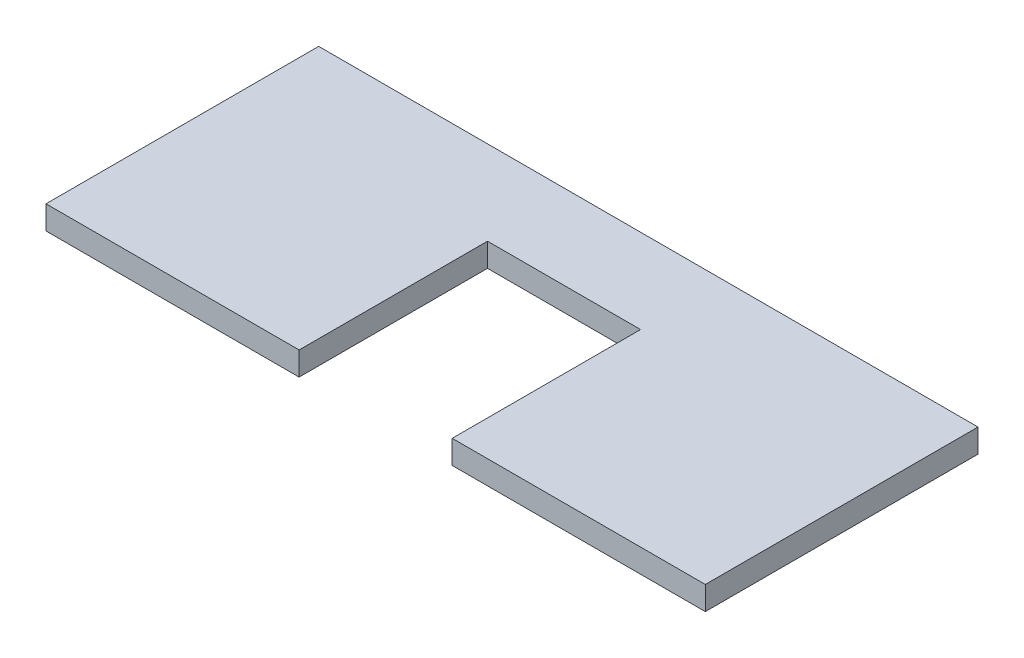
ISO-10303-21;
HEADER;
FILE_DESCRIPTION(('STEP AP214'),'2;1');
FILE_NAME('part.step','',(''),(''),'','','');
FILE_SCHEMA(('AUTOMOTIVE_DESIGN { 1 0 10303 214 1 1 1 1 }'));
ENDSEC;
DATA;
#1=APPLICATION_CONTEXT('core data for automotive mechanical design processes');
#2=APPLICATION_PROTOCOL_DEFINITION('international standard','automotive_design',2000,#1);
#3=PRODUCT_CONTEXT('',#1,'mechanical');
#4=PRODUCT('Part','Part','',(#3));
#5=PRODUCT_RELATED_PRODUCT_CATEGORY('part','',(#4));
#6=PRODUCT_DEFINITION_FORMATION('','',#4);
#7=PRODUCT_DEFINITION_CONTEXT('part definition',#1,'design');
#8=PRODUCT_DEFINITION('design','',#6,#7);
#9=PRODUCT_DEFINITION_SHAPE('','',#8);
#10=(LENGTH_UNIT() NAMED_UNIT(*) SI_UNIT(.MILLI.,.METRE.));
#11=(NAMED_UNIT(*) PLANE_ANGLE_UNIT() SI_UNIT($,.RADIAN.));
#12=(NAMED_UNIT(*) SI_UNIT($,.STERADIAN.) SOLID_ANGLE_UNIT());
#13=UNCERTAINTY_MEASURE_WITH_UNIT(LENGTH_MEASURE(1.E-05),#10,'distance_accuracy_value','');
#14=(GEOMETRIC_REPRESENTATION_CONTEXT(3) GLOBAL_UNCERTAINTY_ASSIGNED_CONTEXT((#13)) GLOBAL_UNIT_ASSIGNED_CONTEXT((#10,
#11,#12)) REPRESENTATION_CONTEXT('',''));
#15=CARTESIAN_POINT('',(0.,0.,0.));
#16=DIRECTION('',(0.,0.,1.));
#17=DIRECTION('',(1.,0.,0.));
#18=AXIS2_PLACEMENT_3D('',#15,#16,#17);
#19=CARTESIAN_POINT('',(-177.8,12.7,-45.466));
#20=DIRECTION('',(1.,0.,0.));
#21=DIRECTION('',(0.,0.,-1.));
#22=AXIS2_PLACEMENT_3D('',#19,#20,#21);
#23=PLANE('',#22);
#24=DIRECTION('',(0.,0.,1.));
#25=VECTOR('',#24,1.);
#26=CARTESIAN_POINT('',(-177.8,0.,-45.466));
#27=LINE('',#26,#25);
#28=CARTESIAN_POINT('',(-177.8,0.,-45.466));
#29=VERTEX_POINT('',#28);
#30=CARTESIAN_POINT('',(-177.8,0.,101.6));
#31=VERTEX_POINT('',#30);
#32=EDGE_CURVE('E132',#29,#31,#27,.T.);
#33=ORIENTED_EDGE('',*,*,#32,.T.);
#34=DIRECTION('',(0.,-1.,0.));
#35=VECTOR('',#34,1.);
#36=CARTESIAN_POINT('',(-177.8,12.7,101.6));
#37=LINE('',#36,#35);
#38=CARTESIAN_POINT('',(-177.8,12.7,101.6));
#39=VERTEX_POINT('',#38);
#40=EDGE_CURVE('E11',#39,#31,#37,.T.);
#41=ORIENTED_EDGE('',*,*,#40,.F.);
#42=DIRECTION('',(0.,0.,1.));
#43=VECTOR('',#42,1.);
#44=CARTESIAN_POINT('',(-177.8,12.7,-45.466));
#45=LINE('',#44,#43);
#46=CARTESIAN_POINT('',(-177.8,12.7,-45.466));
#47=VERTEX_POINT('',#46);
#48=EDGE_CURVE('E146',#47,#39,#45,.T.);
#49=ORIENTED_EDGE('',*,*,#48,.F.);
#50=DIRECTION('',(0.,-1.,0.));
#51=VECTOR('',#50,1.);
#52=CARTESIAN_POINT('',(-177.8,12.7,-45.466));
#53=LINE('',#52,#51);
#54=EDGE_CURVE('E128',#47,#29,#53,.T.);
#55=ORIENTED_EDGE('',*,*,#54,.T.);
#56=EDGE_LOOP('',(#33,#41,#49,#55));
#57=FACE_BOUND('',#56,.T.);
#58=ADVANCED_FACE('F36',(#57),#23,.F.);
#59=CARTESIAN_POINT('',(-177.8,12.7,101.6));
#60=DIRECTION('',(0.,0.,-1.));
#61=DIRECTION('',(-1.,0.,0.));
#62=AXIS2_PLACEMENT_3D('',#59,#60,#61);
#63=PLANE('',#62);
#64=DIRECTION('',(1.,0.,0.));
#65=VECTOR('',#64,1.);
#66=CARTESIAN_POINT('',(-177.8,0.,101.6));
#67=LINE('',#66,#65);
#68=CARTESIAN_POINT('',(-41.275,0.,101.6));
#69=VERTEX_POINT('',#68);
#70=EDGE_CURVE('E135',#31,#69,#67,.T.);
#71=ORIENTED_EDGE('',*,*,#70,.T.);
#72=DIRECTION('',(0.,-1.,0.));
#73=VECTOR('',#72,1.);
#74=CARTESIAN_POINT('',(-41.275,12.7,101.6));
#75=LINE('',#74,#73);
#76=CARTESIAN_POINT('',(-41.275,12.7,101.6));
#77=VERTEX_POINT('',#76);
#78=EDGE_CURVE('E44',#77,#69,#75,.T.);
#79=ORIENTED_EDGE('',*,*,#78,.F.);
#80=DIRECTION('',(1.,0.,0.));
#81=VECTOR('',#80,1.);
#82=CARTESIAN_POINT('',(-177.8,12.7,101.6));
#83=LINE('',#82,#81);
#84=EDGE_CURVE('E95',#39,#77,#83,.T.);
#85=ORIENTED_EDGE('',*,*,#84,.F.);
#86=ORIENTED_EDGE('',*,*,#40,.T.);
#87=EDGE_LOOP('',(#71,#79,#85,#86));
#88=FACE_BOUND('',#87,.T.);
#89=ADVANCED_FACE('F181',(#88),#63,.F.);
#90=CARTESIAN_POINT('',(-41.275,12.7,101.6));
#91=DIRECTION('',(-1.,0.,0.));
#92=DIRECTION('',(0.,0.,1.));
#93=AXIS2_PLACEMENT_3D('',#90,#91,#92);
#94=PLANE('',#93);
#95=DIRECTION('',(0.,0.,-1.));
#96=VECTOR('',#95,1.);
#97=CARTESIAN_POINT('',(-41.275,0.,101.6));
#98=LINE('',#97,#96);
#99=CARTESIAN_POINT('',(-41.275,0.,0.));
#100=VERTEX_POINT('',#99);
#101=EDGE_CURVE('E137',#69,#100,#98,.T.);
#102=ORIENTED_EDGE('',*,*,#101,.T.);
#103=DIRECTION('',(0.,-1.,0.));
#104=VECTOR('',#103,1.);
#105=CARTESIAN_POINT('',(-41.275,12.7,0.));
#106=LINE('',#105,#104);
#107=CARTESIAN_POINT('',(-41.275,12.7,0.));
#108=VERTEX_POINT('',#107);
#109=EDGE_CURVE('E153',#108,#100,#106,.T.);
#110=ORIENTED_EDGE('',*,*,#109,.F.);
#111=DIRECTION('',(0.,0.,-1.));
#112=VECTOR('',#111,1.);
#113=CARTESIAN_POINT('',(-41.275,12.7,101.6));
#114=LINE('',#113,#112);
#115=EDGE_CURVE('E161',#77,#108,#114,.T.);
#116=ORIENTED_EDGE('',*,*,#115,.F.);
#117=ORIENTED_EDGE('',*,*,#78,.T.);
#118=EDGE_LOOP('',(#102,#110,#116,#117));
#119=FACE_BOUND('',#118,.T.);
#120=ADVANCED_FACE('F159',(#119),#94,.F.);
#121=CARTESIAN_POINT('',(-41.275,12.7,0.));
#122=DIRECTION('',(0.,0.,-1.));
#123=DIRECTION('',(-1.,0.,0.));
#124=AXIS2_PLACEMENT_3D('',#121,#122,#123);
#125=PLANE('',#124);
#126=DIRECTION('',(1.,0.,0.));
#127=VECTOR('',#126,1.);
#128=CARTESIAN_POINT('',(-41.275,0.,0.));
#129=LINE('',#128,#127);
#130=CARTESIAN_POINT('',(41.275,0.,0.));
#131=VERTEX_POINT('',#130);
#132=EDGE_CURVE('E139',#100,#131,#129,.T.);
#133=ORIENTED_EDGE('',*,*,#132,.T.);
#134=DIRECTION('',(0.,-1.,0.));
#135=VECTOR('',#134,1.);
#136=CARTESIAN_POINT('',(41.275,12.7,0.));
#137=LINE('',#136,#135);
#138=CARTESIAN_POINT('',(41.275,12.7,0.));
#139=VERTEX_POINT('',#138);
#140=EDGE_CURVE('E150',#139,#131,#137,.T.);
#141=ORIENTED_EDGE('',*,*,#140,.F.);
#142=DIRECTION('',(1.,0.,0.));
#143=VECTOR('',#142,1.);
#144=CARTESIAN_POINT('',(-41.275,12.7,0.));
#145=LINE('',#144,#143);
#146=EDGE_CURVE('E173',#108,#139,#145,.T.);
#147=ORIENTED_EDGE('',*,*,#146,.F.);
#148=ORIENTED_EDGE('',*,*,#109,.T.);
#149=EDGE_LOOP('',(#133,#141,#147,#148));
#150=FACE_BOUND('',#149,.T.);
#151=ADVANCED_FACE('F169',(#150),#125,.F.);
#152=CARTESIAN_POINT('',(41.275,12.7,101.6));
#153=DIRECTION('',(1.,0.,0.));
#154=DIRECTION('',(0.,0.,-1.));
#155=AXIS2_PLACEMENT_3D('',#152,#153,#154);
#156=PLANE('',#155);
#157=DIRECTION('',(0.,0.,1.));
#158=VECTOR('',#157,1.);
#159=CARTESIAN_POINT('',(41.275,0.,101.6));
#160=LINE('',#159,#158);
#161=CARTESIAN_POINT('',(41.275,0.,101.6));
#162=VERTEX_POINT('',#161);
#163=EDGE_CURVE('E141',#131,#162,#160,.T.);
#164=ORIENTED_EDGE('',*,*,#163,.T.);
#165=DIRECTION('',(0.,-1.,0.));
#166=VECTOR('',#165,1.);
#167=CARTESIAN_POINT('',(41.275,12.7,101.6));
#168=LINE('',#167,#166);
#169=CARTESIAN_POINT('',(41.275,12.7,101.6));
#170=VERTEX_POINT('',#169);
#171=EDGE_CURVE('E123',#170,#162,#168,.T.);
#172=ORIENTED_EDGE('',*,*,#171,.F.);
#173=DIRECTION('',(0.,0.,1.));
#174=VECTOR('',#173,1.);
#175=CARTESIAN_POINT('',(41.275,12.7,101.6));
#176=LINE('',#175,#174);
#177=EDGE_CURVE('E114',#139,#170,#176,.T.);
#178=ORIENTED_EDGE('',*,*,#177,.F.);
#179=ORIENTED_EDGE('',*,*,#140,.T.);
#180=EDGE_LOOP('',(#164,#172,#178,#179));
#181=FACE_BOUND('',#180,.T.);
#182=ADVANCED_FACE('F172',(#181),#156,.F.);
#183=CARTESIAN_POINT('',(41.275,12.7,101.6));
#184=DIRECTION('',(0.,0.,-1.));
#185=DIRECTION('',(-1.,0.,0.));
#186=AXIS2_PLACEMENT_3D('',#183,#184,#185);
#187=PLANE('',#186);
#188=DIRECTION('',(1.,0.,0.));
#189=VECTOR('',#188,1.);
#190=CARTESIAN_POINT('',(41.275,0.,101.6));
#191=LINE('',#190,#189);
#192=CARTESIAN_POINT('',(177.8,0.,101.6));
#193=VERTEX_POINT('',#192);
#194=EDGE_CURVE('E122',#162,#193,#191,.T.);
#195=ORIENTED_EDGE('',*,*,#194,.T.);
#196=DIRECTION('',(0.,-1.,0.));
#197=VECTOR('',#196,1.);
#198=CARTESIAN_POINT('',(177.8,12.7,101.6));
#199=LINE('',#198,#197);
#200=CARTESIAN_POINT('',(177.8,12.7,101.6));
#201=VERTEX_POINT('',#200);
#202=EDGE_CURVE('E119',#201,#193,#199,.T.);
#203=ORIENTED_EDGE('',*,*,#202,.F.);
#204=DIRECTION('',(1.,0.,0.));
#205=VECTOR('',#204,1.);
#206=CARTESIAN_POINT('',(41.275,12.7,101.6));
#207=LINE('',#206,#205);
#208=EDGE_CURVE('E108',#170,#201,#207,.T.);
#209=ORIENTED_EDGE('',*,*,#208,.F.);
#210=ORIENTED_EDGE('',*,*,#171,.T.);
#211=EDGE_LOOP('',(#195,#203,#209,#210));
#212=FACE_BOUND('',#211,.T.);
#213=ADVANCED_FACE('F120',(#212),#187,.F.);
#214=CARTESIAN_POINT('',(177.8,12.7,-45.4660000000001));
#215=DIRECTION('',(-1.,0.,0.));
#216=DIRECTION('',(0.,0.,1.));
#217=AXIS2_PLACEMENT_3D('',#214,#215,#216);
#218=PLANE('',#217);
#219=DIRECTION('',(0.,0.,-1.));
#220=VECTOR('',#219,1.);
#221=CARTESIAN_POINT('',(177.8,0.,-45.4660000000001));
#222=LINE('',#221,#220);
#223=CARTESIAN_POINT('',(177.8,0.,-45.4660000000001));
#224=VERTEX_POINT('',#223);
#225=EDGE_CURVE('E81',#193,#224,#222,.T.);
#226=ORIENTED_EDGE('',*,*,#225,.T.);
#227=DIRECTION('',(0.,-1.,0.));
#228=VECTOR('',#227,1.);
#229=CARTESIAN_POINT('',(177.8,12.7,-45.4660000000001));
#230=LINE('',#229,#228);
#231=CARTESIAN_POINT('',(177.8,12.7,-45.4660000000001));
#232=VERTEX_POINT('',#231);
#233=EDGE_CURVE('E124',#232,#224,#230,.T.);
#234=ORIENTED_EDGE('',*,*,#233,.F.);
#235=DIRECTION('',(0.,0.,-1.));
#236=VECTOR('',#235,1.);
#237=CARTESIAN_POINT('',(177.8,12.7,-45.4660000000001));
#238=LINE('',#237,#236);
#239=EDGE_CURVE('E112',#201,#232,#238,.T.);
#240=ORIENTED_EDGE('',*,*,#239,.F.);
#241=ORIENTED_EDGE('',*,*,#202,.T.);
#242=EDGE_LOOP('',(#226,#234,#240,#241));
#243=FACE_BOUND('',#242,.T.);
#244=ADVANCED_FACE('F126',(#243),#218,.F.);
#245=CARTESIAN_POINT('',(-177.8,12.7,-45.466));
#246=DIRECTION('',(0.,0.,1.));
#247=DIRECTION('',(1.,0.,0.));
#248=AXIS2_PLACEMENT_3D('',#245,#246,#247);
#249=PLANE('',#248);
#250=DIRECTION('',(-1.,0.,0.));
#251=VECTOR('',#250,1.);
#252=CARTESIAN_POINT('',(-177.8,0.,-45.466));
#253=LINE('',#252,#251);
#254=EDGE_CURVE('E87',#224,#29,#253,.T.);
#255=ORIENTED_EDGE('',*,*,#254,.T.);
#256=ORIENTED_EDGE('',*,*,#54,.F.);
#257=DIRECTION('',(-1.,0.,0.));
#258=VECTOR('',#257,1.);
#259=CARTESIAN_POINT('',(-177.8,12.7,-45.466));
#260=LINE('',#259,#258);
#261=EDGE_CURVE('E52',#232,#47,#260,.T.);
#262=ORIENTED_EDGE('',*,*,#261,.F.);
#263=ORIENTED_EDGE('',*,*,#233,.T.);
#264=EDGE_LOOP('',(#255,#256,#262,#263));
#265=FACE_BOUND('',#264,.T.);
#266=ADVANCED_FACE('F197',(#265),#249,.F.);
#267=CARTESIAN_POINT('',(0.,12.7,0.));
#268=DIRECTION('',(0.,1.,0.));
#269=DIRECTION('',(0.,0.,1.));
#270=AXIS2_PLACEMENT_3D('',#267,#268,#269);
#271=PLANE('',#270);
#272=ORIENTED_EDGE('',*,*,#48,.T.);
#273=ORIENTED_EDGE('',*,*,#84,.T.);
#274=ORIENTED_EDGE('',*,*,#115,.T.);
#275=ORIENTED_EDGE('',*,*,#146,.T.);
#276=ORIENTED_EDGE('',*,*,#177,.T.);
#277=ORIENTED_EDGE('',*,*,#208,.T.);
#278=ORIENTED_EDGE('',*,*,#239,.T.);
#279=ORIENTED_EDGE('',*,*,#261,.T.);
#280=EDGE_LOOP('',(#272,#273,#274,#275,#276,#277,#278,#279));
#281=FACE_BOUND('',#280,.T.);
#282=ADVANCED_FACE('F110',(#281),#271,.T.);
#283=CARTESIAN_POINT('',(0.,0.,0.));
#284=DIRECTION('',(0.,1.,0.));
#285=DIRECTION('',(0.,0.,1.));
#286=AXIS2_PLACEMENT_3D('',#283,#284,#285);
#287=PLANE('',#286);
#288=ORIENTED_EDGE('',*,*,#32,.F.);
#289=ORIENTED_EDGE('',*,*,#254,.F.);
#290=ORIENTED_EDGE('',*,*,#225,.F.);
#291=ORIENTED_EDGE('',*,*,#194,.F.);
#292=ORIENTED_EDGE('',*,*,#163,.F.);
#293=ORIENTED_EDGE('',*,*,#132,.F.);
#294=ORIENTED_EDGE('',*,*,#101,.F.);
#295=ORIENTED_EDGE('',*,*,#70,.F.);
#296=EDGE_LOOP('',(#288,#289,#290,#291,#292,#293,#294,#295));
#297=FACE_BOUND('',#296,.T.);
#298=ADVANCED_FACE('F165',(#297),#287,.F.);
#299=CLOSED_SHELL('',(#58,#89,#120,#151,#182,#213,#244,#266,#282,#298));
#300=MANIFOLD_SOLID_BREP('B2',#299);
#301=ADVANCED_BREP_SHAPE_REPRESENTATION('',(#18,#300),#14);
#302=SHAPE_DEFINITION_REPRESENTATION(#9,#301);
ENDSEC;
END-ISO-10303-21;
